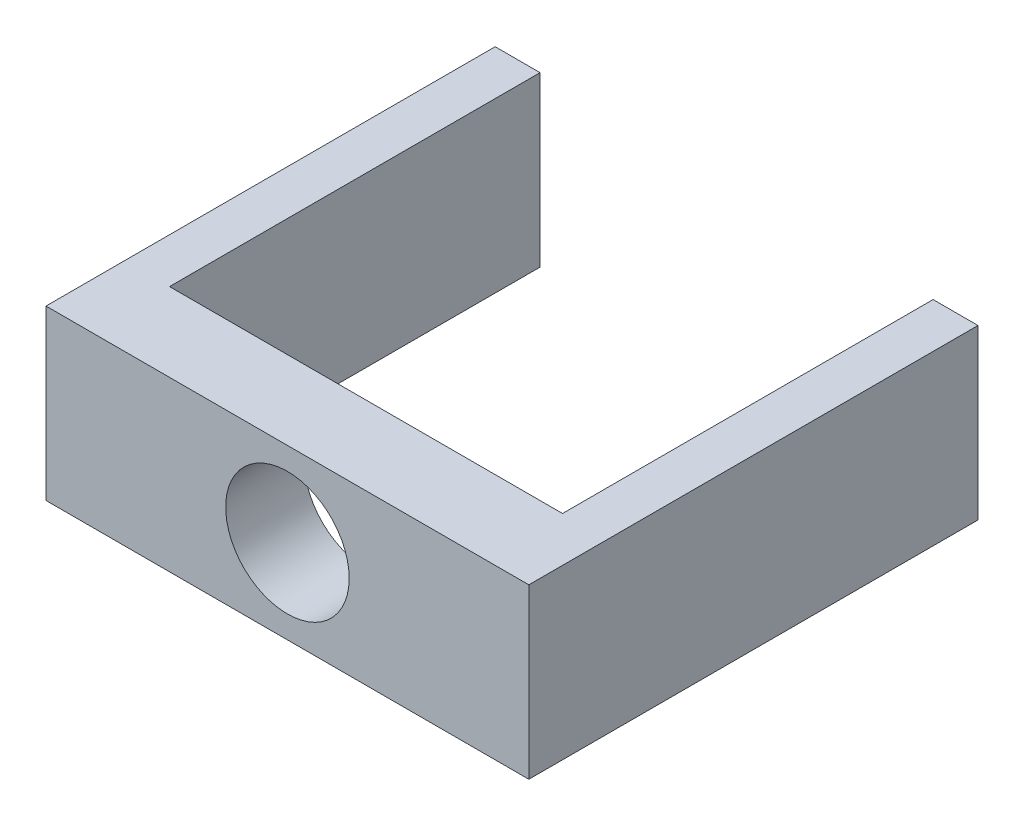
ISO-10303-21;
HEADER;
FILE_DESCRIPTION(('STEP AP214'),'2;1');
FILE_NAME('part.step','',(''),(''),'','','');
FILE_SCHEMA(('AUTOMOTIVE_DESIGN { 1 0 10303 214 1 1 1 1 }'));
ENDSEC;
DATA;
#1=APPLICATION_CONTEXT('core data for automotive mechanical design processes');
#2=APPLICATION_PROTOCOL_DEFINITION('international standard','automotive_design',2000,#1);
#3=PRODUCT_CONTEXT('',#1,'mechanical');
#4=PRODUCT('Part','Part','',(#3));
#5=PRODUCT_RELATED_PRODUCT_CATEGORY('part','',(#4));
#6=PRODUCT_DEFINITION_FORMATION('','',#4);
#7=PRODUCT_DEFINITION_CONTEXT('part definition',#1,'design');
#8=PRODUCT_DEFINITION('design','',#6,#7);
#9=PRODUCT_DEFINITION_SHAPE('','',#8);
#10=(LENGTH_UNIT() NAMED_UNIT(*) SI_UNIT(.MILLI.,.METRE.));
#11=(NAMED_UNIT(*) PLANE_ANGLE_UNIT() SI_UNIT($,.RADIAN.));
#12=(NAMED_UNIT(*) SI_UNIT($,.STERADIAN.) SOLID_ANGLE_UNIT());
#13=UNCERTAINTY_MEASURE_WITH_UNIT(LENGTH_MEASURE(1.E-05),#10,'distance_accuracy_value','');
#14=(GEOMETRIC_REPRESENTATION_CONTEXT(3) GLOBAL_UNCERTAINTY_ASSIGNED_CONTEXT((#13)) GLOBAL_UNIT_ASSIGNED_CONTEXT((#10,
#11,#12)) REPRESENTATION_CONTEXT('',''));
#15=CARTESIAN_POINT('',(0.,0.,0.));
#16=DIRECTION('',(0.,0.,1.));
#17=DIRECTION('',(1.,0.,0.));
#18=AXIS2_PLACEMENT_3D('',#15,#16,#17);
#19=CARTESIAN_POINT('',(0.,0.,7.));
#20=DIRECTION('',(0.,0.,1.));
#21=DIRECTION('',(1.,0.,0.));
#22=AXIS2_PLACEMENT_3D('',#19,#20,#21);
#23=PLANE('',#22);
#24=DIRECTION('',(1.,0.,0.));
#25=VECTOR('',#24,1.);
#26=CARTESIAN_POINT('',(-17.5,-7.5,7.));
#27=LINE('',#26,#25);
#28=CARTESIAN_POINT('',(-21.5,-7.5,7.));
#29=VERTEX_POINT('',#28);
#30=CARTESIAN_POINT('',(21.5,-7.5,7.));
#31=VERTEX_POINT('',#30);
#32=EDGE_CURVE('E11',#29,#31,#27,.T.);
#33=ORIENTED_EDGE('',*,*,#32,.T.);
#34=DIRECTION('',(0.,1.,0.));
#35=VECTOR('',#34,1.);
#36=CARTESIAN_POINT('',(21.5,-7.5,7.));
#37=LINE('',#36,#35);
#38=CARTESIAN_POINT('',(21.5,7.5,7.));
#39=VERTEX_POINT('',#38);
#40=EDGE_CURVE('E128',#31,#39,#37,.T.);
#41=ORIENTED_EDGE('',*,*,#40,.T.);
#42=DIRECTION('',(-1.,0.,0.));
#43=VECTOR('',#42,1.);
#44=CARTESIAN_POINT('',(-17.5,7.5,7.));
#45=LINE('',#44,#43);
#46=CARTESIAN_POINT('',(-21.5,7.49999999999999,7.));
#47=VERTEX_POINT('',#46);
#48=EDGE_CURVE('E41',#39,#47,#45,.T.);
#49=ORIENTED_EDGE('',*,*,#48,.T.);
#50=DIRECTION('',(0.,-1.,0.));
#51=VECTOR('',#50,1.);
#52=CARTESIAN_POINT('',(-21.5,-7.5,7.));
#53=LINE('',#52,#51);
#54=EDGE_CURVE('E120',#47,#29,#53,.T.);
#55=ORIENTED_EDGE('',*,*,#54,.T.);
#56=EDGE_LOOP('',(#33,#41,#49,#55));
#57=FACE_BOUND('',#56,.T.);
#58=CARTESIAN_POINT('',(0.,0.,7.));
#59=DIRECTION('',(0.,0.,1.));
#60=DIRECTION('',(1.,0.,0.));
#61=AXIS2_PLACEMENT_3D('',#58,#59,#60);
#62=CIRCLE('',#61,5.5);
#63=CARTESIAN_POINT('',(5.5,0.,7.));
#64=VERTEX_POINT('',#63);
#65=EDGE_CURVE('E159',#64,#64,#62,.T.);
#66=ORIENTED_EDGE('',*,*,#65,.F.);
#67=EDGE_LOOP('',(#66));
#68=FACE_BOUND('',#67,.T.);
#69=ADVANCED_FACE('F32',(#57,#68),#23,.T.);
#70=CARTESIAN_POINT('',(0.,0.,0.));
#71=DIRECTION('',(0.,0.,1.));
#72=DIRECTION('',(1.,0.,0.));
#73=AXIS2_PLACEMENT_3D('',#70,#71,#72);
#74=PLANE('',#73);
#75=DIRECTION('',(0.,1.,0.));
#76=VECTOR('',#75,1.);
#77=CARTESIAN_POINT('',(17.5,7.5,0.));
#78=LINE('',#77,#76);
#79=CARTESIAN_POINT('',(17.5,-7.5,0.));
#80=VERTEX_POINT('',#79);
#81=CARTESIAN_POINT('',(17.5,7.5,0.));
#82=VERTEX_POINT('',#81);
#83=EDGE_CURVE('E162',#80,#82,#78,.T.);
#84=ORIENTED_EDGE('',*,*,#83,.F.);
#85=DIRECTION('',(1.,0.,0.));
#86=VECTOR('',#85,1.);
#87=CARTESIAN_POINT('',(-17.5,-7.5,0.));
#88=LINE('',#87,#86);
#89=CARTESIAN_POINT('',(-17.5,-7.5,0.));
#90=VERTEX_POINT('',#89);
#91=EDGE_CURVE('E36',#90,#80,#88,.T.);
#92=ORIENTED_EDGE('',*,*,#91,.F.);
#93=DIRECTION('',(0.,-1.,0.));
#94=VECTOR('',#93,1.);
#95=CARTESIAN_POINT('',(-17.5,7.5,0.));
#96=LINE('',#95,#94);
#97=CARTESIAN_POINT('',(-17.5,7.5,0.));
#98=VERTEX_POINT('',#97);
#99=EDGE_CURVE('E102',#98,#90,#96,.T.);
#100=ORIENTED_EDGE('',*,*,#99,.F.);
#101=DIRECTION('',(-1.,0.,0.));
#102=VECTOR('',#101,1.);
#103=CARTESIAN_POINT('',(-17.5,7.5,0.));
#104=LINE('',#103,#102);
#105=EDGE_CURVE('E56',#82,#98,#104,.T.);
#106=ORIENTED_EDGE('',*,*,#105,.F.);
#107=EDGE_LOOP('',(#84,#92,#100,#106));
#108=FACE_BOUND('',#107,.T.);
#109=CARTESIAN_POINT('',(0.,0.,0.));
#110=DIRECTION('',(0.,0.,1.));
#111=DIRECTION('',(1.,0.,0.));
#112=AXIS2_PLACEMENT_3D('',#109,#110,#111);
#113=CIRCLE('',#112,5.5);
#114=CARTESIAN_POINT('',(5.5,0.,0.));
#115=VERTEX_POINT('',#114);
#116=EDGE_CURVE('E151',#115,#115,#113,.T.);
#117=ORIENTED_EDGE('',*,*,#116,.T.);
#118=EDGE_LOOP('',(#117));
#119=FACE_BOUND('',#118,.T.);
#120=ADVANCED_FACE('F195',(#108,#119),#74,.F.);
#121=CARTESIAN_POINT('',(-17.5,7.5,7.));
#122=DIRECTION('',(0.,-1.,0.));
#123=DIRECTION('',(0.,0.,-1.));
#124=AXIS2_PLACEMENT_3D('',#121,#122,#123);
#125=PLANE('',#124);
#126=ORIENTED_EDGE('',*,*,#105,.T.);
#127=DIRECTION('',(0.,0.,1.));
#128=VECTOR('',#127,1.);
#129=CARTESIAN_POINT('',(-17.5,7.5,-33.));
#130=LINE('',#129,#128);
#131=CARTESIAN_POINT('',(-17.5,7.5,-33.));
#132=VERTEX_POINT('',#131);
#133=EDGE_CURVE('E104',#132,#98,#130,.T.);
#134=ORIENTED_EDGE('',*,*,#133,.F.);
#135=DIRECTION('',(-1.,0.,0.));
#136=VECTOR('',#135,1.);
#137=CARTESIAN_POINT('',(-17.5,7.5,-33.));
#138=LINE('',#137,#136);
#139=CARTESIAN_POINT('',(-21.5,7.49999999999999,-33.));
#140=VERTEX_POINT('',#139);
#141=EDGE_CURVE('E115',#132,#140,#138,.T.);
#142=ORIENTED_EDGE('',*,*,#141,.T.);
#143=DIRECTION('',(0.,0.,1.));
#144=VECTOR('',#143,1.);
#145=CARTESIAN_POINT('',(-21.5,7.49999999999999,-33.));
#146=LINE('',#145,#144);
#147=EDGE_CURVE('E129',#140,#47,#146,.T.);
#148=ORIENTED_EDGE('',*,*,#147,.T.);
#149=ORIENTED_EDGE('',*,*,#48,.F.);
#150=DIRECTION('',(0.,0.,1.));
#151=VECTOR('',#150,1.);
#152=CARTESIAN_POINT('',(21.5,7.5,-33.));
#153=LINE('',#152,#151);
#154=CARTESIAN_POINT('',(21.5,7.5,-33.));
#155=VERTEX_POINT('',#154);
#156=EDGE_CURVE('E154',#155,#39,#153,.T.);
#157=ORIENTED_EDGE('',*,*,#156,.F.);
#158=DIRECTION('',(-1.,0.,0.));
#159=VECTOR('',#158,1.);
#160=CARTESIAN_POINT('',(17.5,7.5,-33.));
#161=LINE('',#160,#159);
#162=CARTESIAN_POINT('',(17.5,7.5,-33.));
#163=VERTEX_POINT('',#162);
#164=EDGE_CURVE('E139',#155,#163,#161,.T.);
#165=ORIENTED_EDGE('',*,*,#164,.T.);
#166=DIRECTION('',(0.,0.,1.));
#167=VECTOR('',#166,1.);
#168=CARTESIAN_POINT('',(17.5,7.5,-33.));
#169=LINE('',#168,#167);
#170=EDGE_CURVE('E152',#163,#82,#169,.T.);
#171=ORIENTED_EDGE('',*,*,#170,.T.);
#172=EDGE_LOOP('',(#126,#134,#142,#148,#149,#157,#165,#171));
#173=FACE_BOUND('',#172,.T.);
#174=ADVANCED_FACE('F34',(#173),#125,.F.);
#175=CARTESIAN_POINT('',(-17.5,-7.5,7.));
#176=DIRECTION('',(0.,1.,0.));
#177=DIRECTION('',(0.,0.,1.));
#178=AXIS2_PLACEMENT_3D('',#175,#176,#177);
#179=PLANE('',#178);
#180=ORIENTED_EDGE('',*,*,#91,.T.);
#181=DIRECTION('',(0.,0.,1.));
#182=VECTOR('',#181,1.);
#183=CARTESIAN_POINT('',(17.5,-7.5,-33.));
#184=LINE('',#183,#182);
#185=CARTESIAN_POINT('',(17.5,-7.5,-33.));
#186=VERTEX_POINT('',#185);
#187=EDGE_CURVE('E148',#186,#80,#184,.T.);
#188=ORIENTED_EDGE('',*,*,#187,.F.);
#189=DIRECTION('',(1.,0.,0.));
#190=VECTOR('',#189,1.);
#191=CARTESIAN_POINT('',(17.5,-7.5,-33.));
#192=LINE('',#191,#190);
#193=CARTESIAN_POINT('',(21.5,-7.5,-33.));
#194=VERTEX_POINT('',#193);
#195=EDGE_CURVE('E133',#186,#194,#192,.T.);
#196=ORIENTED_EDGE('',*,*,#195,.T.);
#197=DIRECTION('',(0.,0.,1.));
#198=VECTOR('',#197,1.);
#199=CARTESIAN_POINT('',(21.5,-7.5,-33.));
#200=LINE('',#199,#198);
#201=EDGE_CURVE('E145',#194,#31,#200,.T.);
#202=ORIENTED_EDGE('',*,*,#201,.T.);
#203=ORIENTED_EDGE('',*,*,#32,.F.);
#204=DIRECTION('',(0.,0.,1.));
#205=VECTOR('',#204,1.);
#206=CARTESIAN_POINT('',(-21.5,-7.5,-33.));
#207=LINE('',#206,#205);
#208=CARTESIAN_POINT('',(-21.5,-7.5,-33.));
#209=VERTEX_POINT('',#208);
#210=EDGE_CURVE('E119',#209,#29,#207,.T.);
#211=ORIENTED_EDGE('',*,*,#210,.F.);
#212=DIRECTION('',(1.,0.,0.));
#213=VECTOR('',#212,1.);
#214=CARTESIAN_POINT('',(-17.5,-7.5,-33.));
#215=LINE('',#214,#213);
#216=CARTESIAN_POINT('',(-17.5,-7.5,-33.));
#217=VERTEX_POINT('',#216);
#218=EDGE_CURVE('E112',#209,#217,#215,.T.);
#219=ORIENTED_EDGE('',*,*,#218,.T.);
#220=DIRECTION('',(0.,0.,1.));
#221=VECTOR('',#220,1.);
#222=CARTESIAN_POINT('',(-17.5,-7.5,-33.));
#223=LINE('',#222,#221);
#224=EDGE_CURVE('E97',#217,#90,#223,.T.);
#225=ORIENTED_EDGE('',*,*,#224,.T.);
#226=EDGE_LOOP('',(#180,#188,#196,#202,#203,#211,#219,#225));
#227=FACE_BOUND('',#226,.T.);
#228=ADVANCED_FACE('F117',(#227),#179,.F.);
#229=CARTESIAN_POINT('',(0.,0.,7.));
#230=DIRECTION('',(0.,0.,-1.));
#231=DIRECTION('',(-1.,0.,0.));
#232=AXIS2_PLACEMENT_3D('',#229,#230,#231);
#233=CYLINDRICAL_SURFACE('',#232,5.5);
#234=ORIENTED_EDGE('',*,*,#65,.T.);
#235=EDGE_LOOP('',(#234));
#236=FACE_BOUND('',#235,.T.);
#237=ORIENTED_EDGE('',*,*,#116,.F.);
#238=EDGE_LOOP('',(#237));
#239=FACE_BOUND('',#238,.T.);
#240=ADVANCED_FACE('F202',(#236,#239),#233,.F.);
#241=CARTESIAN_POINT('',(17.5,-7.5,-33.));
#242=DIRECTION('',(-1.,0.,0.));
#243=DIRECTION('',(0.,0.,1.));
#244=AXIS2_PLACEMENT_3D('',#241,#242,#243);
#245=PLANE('',#244);
#246=ORIENTED_EDGE('',*,*,#187,.T.);
#247=ORIENTED_EDGE('',*,*,#83,.T.);
#248=ORIENTED_EDGE('',*,*,#170,.F.);
#249=DIRECTION('',(0.,-1.,0.));
#250=VECTOR('',#249,1.);
#251=CARTESIAN_POINT('',(17.5,-7.5,-33.));
#252=LINE('',#251,#250);
#253=EDGE_CURVE('E142',#163,#186,#252,.T.);
#254=ORIENTED_EDGE('',*,*,#253,.T.);
#255=EDGE_LOOP('',(#246,#247,#248,#254));
#256=FACE_BOUND('',#255,.T.);
#257=ADVANCED_FACE('F169',(#256),#245,.T.);
#258=CARTESIAN_POINT('',(21.5,-7.5,-33.));
#259=DIRECTION('',(1.,0.,0.));
#260=DIRECTION('',(0.,0.,-1.));
#261=AXIS2_PLACEMENT_3D('',#258,#259,#260);
#262=PLANE('',#261);
#263=ORIENTED_EDGE('',*,*,#40,.F.);
#264=ORIENTED_EDGE('',*,*,#201,.F.);
#265=DIRECTION('',(0.,1.,0.));
#266=VECTOR('',#265,1.);
#267=CARTESIAN_POINT('',(21.5,-7.5,-33.));
#268=LINE('',#267,#266);
#269=EDGE_CURVE('E136',#194,#155,#268,.T.);
#270=ORIENTED_EDGE('',*,*,#269,.T.);
#271=ORIENTED_EDGE('',*,*,#156,.T.);
#272=EDGE_LOOP('',(#263,#264,#270,#271));
#273=FACE_BOUND('',#272,.T.);
#274=ADVANCED_FACE('F179',(#273),#262,.T.);
#275=CARTESIAN_POINT('',(0.,0.,-33.));
#276=DIRECTION('',(0.,0.,1.));
#277=DIRECTION('',(1.,0.,0.));
#278=AXIS2_PLACEMENT_3D('',#275,#276,#277);
#279=PLANE('',#278);
#280=ORIENTED_EDGE('',*,*,#195,.F.);
#281=ORIENTED_EDGE('',*,*,#253,.F.);
#282=ORIENTED_EDGE('',*,*,#164,.F.);
#283=ORIENTED_EDGE('',*,*,#269,.F.);
#284=EDGE_LOOP('',(#280,#281,#282,#283));
#285=FACE_BOUND('',#284,.T.);
#286=ADVANCED_FACE('F176',(#285),#279,.F.);
#287=CARTESIAN_POINT('',(-21.5,-7.5,-33.));
#288=DIRECTION('',(-1.,0.,0.));
#289=DIRECTION('',(0.,0.,1.));
#290=AXIS2_PLACEMENT_3D('',#287,#288,#289);
#291=PLANE('',#290);
#292=ORIENTED_EDGE('',*,*,#54,.F.);
#293=ORIENTED_EDGE('',*,*,#147,.F.);
#294=DIRECTION('',(0.,-1.,0.));
#295=VECTOR('',#294,1.);
#296=CARTESIAN_POINT('',(-21.5,-7.5,-33.));
#297=LINE('',#296,#295);
#298=EDGE_CURVE('E105',#140,#209,#297,.T.);
#299=ORIENTED_EDGE('',*,*,#298,.T.);
#300=ORIENTED_EDGE('',*,*,#210,.T.);
#301=EDGE_LOOP('',(#292,#293,#299,#300));
#302=FACE_BOUND('',#301,.T.);
#303=ADVANCED_FACE('F184',(#302),#291,.T.);
#304=CARTESIAN_POINT('',(-17.5,-7.5,-33.));
#305=DIRECTION('',(1.,0.,0.));
#306=DIRECTION('',(0.,0.,-1.));
#307=AXIS2_PLACEMENT_3D('',#304,#305,#306);
#308=PLANE('',#307);
#309=ORIENTED_EDGE('',*,*,#133,.T.);
#310=ORIENTED_EDGE('',*,*,#99,.T.);
#311=ORIENTED_EDGE('',*,*,#224,.F.);
#312=DIRECTION('',(0.,1.,0.));
#313=VECTOR('',#312,1.);
#314=CARTESIAN_POINT('',(-17.5,-7.5,-33.));
#315=LINE('',#314,#313);
#316=EDGE_CURVE('E101',#217,#132,#315,.T.);
#317=ORIENTED_EDGE('',*,*,#316,.T.);
#318=EDGE_LOOP('',(#309,#310,#311,#317));
#319=FACE_BOUND('',#318,.T.);
#320=ADVANCED_FACE('F100',(#319),#308,.T.);
#321=CARTESIAN_POINT('',(0.,0.,-33.));
#322=DIRECTION('',(0.,0.,-1.));
#323=DIRECTION('',(-1.,0.,0.));
#324=AXIS2_PLACEMENT_3D('',#321,#322,#323);
#325=PLANE('',#324);
#326=ORIENTED_EDGE('',*,*,#218,.F.);
#327=ORIENTED_EDGE('',*,*,#298,.F.);
#328=ORIENTED_EDGE('',*,*,#141,.F.);
#329=ORIENTED_EDGE('',*,*,#316,.F.);
#330=EDGE_LOOP('',(#326,#327,#328,#329));
#331=FACE_BOUND('',#330,.T.);
#332=ADVANCED_FACE('F110',(#331),#325,.T.);
#333=CLOSED_SHELL('',(#69,#120,#174,#228,#240,#257,#274,#286,#303,#320,#332));
#334=MANIFOLD_SOLID_BREP('B2',#333);
#335=ADVANCED_BREP_SHAPE_REPRESENTATION('',(#18,#334),#14);
#336=SHAPE_DEFINITION_REPRESENTATION(#9,#335);
ENDSEC;
END-ISO-10303-21;
